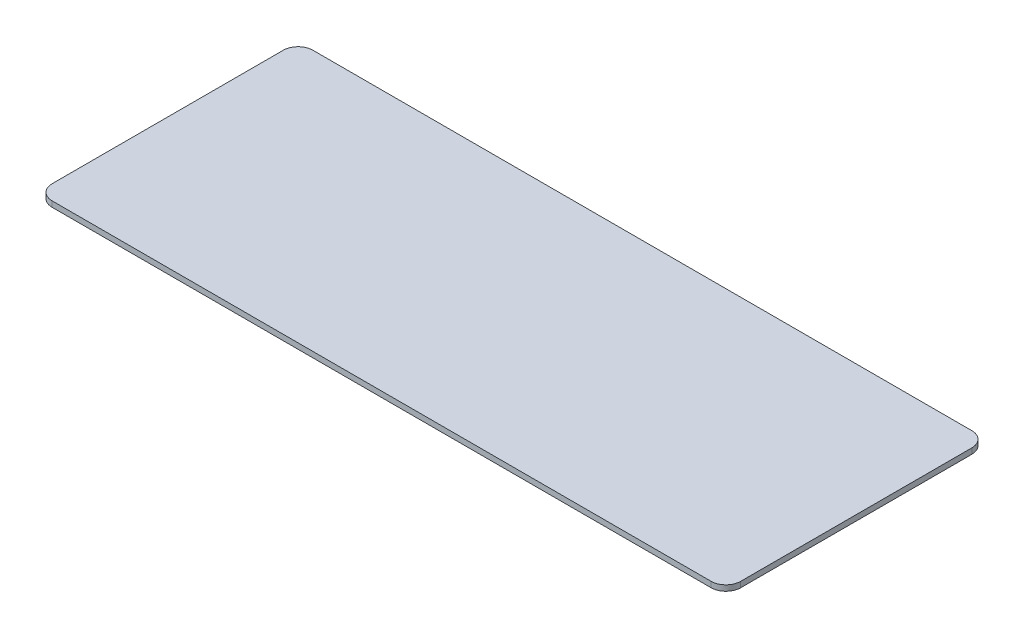
ISO-10303-21;
HEADER;
FILE_DESCRIPTION(('STEP AP214'),'2;1');
FILE_NAME('part.step','',(''),(''),'','','');
FILE_SCHEMA(('AUTOMOTIVE_DESIGN { 1 0 10303 214 1 1 1 1 }'));
ENDSEC;
DATA;
#1=APPLICATION_CONTEXT('core data for automotive mechanical design processes');
#2=APPLICATION_PROTOCOL_DEFINITION('international standard','automotive_design',2000,#1);
#3=PRODUCT_CONTEXT('',#1,'mechanical');
#4=PRODUCT('Part','Part','',(#3));
#5=PRODUCT_RELATED_PRODUCT_CATEGORY('part','',(#4));
#6=PRODUCT_DEFINITION_FORMATION('','',#4);
#7=PRODUCT_DEFINITION_CONTEXT('part definition',#1,'design');
#8=PRODUCT_DEFINITION('design','',#6,#7);
#9=PRODUCT_DEFINITION_SHAPE('','',#8);
#10=(LENGTH_UNIT() NAMED_UNIT(*) SI_UNIT(.MILLI.,.METRE.));
#11=(NAMED_UNIT(*) PLANE_ANGLE_UNIT() SI_UNIT($,.RADIAN.));
#12=(NAMED_UNIT(*) SI_UNIT($,.STERADIAN.) SOLID_ANGLE_UNIT());
#13=UNCERTAINTY_MEASURE_WITH_UNIT(LENGTH_MEASURE(1.E-05),#10,'distance_accuracy_value','');
#14=(GEOMETRIC_REPRESENTATION_CONTEXT(3) GLOBAL_UNCERTAINTY_ASSIGNED_CONTEXT((#13)) GLOBAL_UNIT_ASSIGNED_CONTEXT((#10,
#11,#12)) REPRESENTATION_CONTEXT('',''));
#15=CARTESIAN_POINT('',(0.,0.,0.));
#16=DIRECTION('',(0.,0.,1.));
#17=DIRECTION('',(1.,0.,0.));
#18=AXIS2_PLACEMENT_3D('',#15,#16,#17);
#19=CARTESIAN_POINT('',(184.1355,1.5,69.7451));
#20=DIRECTION('',(-1.,0.,0.));
#21=DIRECTION('',(0.,0.,1.));
#22=AXIS2_PLACEMENT_3D('',#19,#20,#21);
#23=PLANE('',#22);
#24=DIRECTION('',(0.,0.,-1.));
#25=VECTOR('',#24,1.);
#26=CARTESIAN_POINT('',(184.1355,1.5,69.7451));
#27=LINE('',#26,#25);
#28=CARTESIAN_POINT('',(184.1355,1.5,61.8076));
#29=VERTEX_POINT('',#28);
#30=CARTESIAN_POINT('',(184.1355,1.5,-61.8076));
#31=VERTEX_POINT('',#30);
#32=EDGE_CURVE('E120',#29,#31,#27,.T.);
#33=ORIENTED_EDGE('',*,*,#32,.F.);
#34=DIRECTION('',(0.,-1.,0.));
#35=VECTOR('',#34,1.);
#36=CARTESIAN_POINT('',(184.1355,1.5,61.8076));
#37=LINE('',#36,#35);
#38=CARTESIAN_POINT('',(184.1355,-1.5,61.8076));
#39=VERTEX_POINT('',#38);
#40=EDGE_CURVE('E105',#29,#39,#37,.T.);
#41=ORIENTED_EDGE('',*,*,#40,.T.);
#42=DIRECTION('',(0.,0.,-1.));
#43=VECTOR('',#42,1.);
#44=CARTESIAN_POINT('',(184.1355,-1.5,69.7451));
#45=LINE('',#44,#43);
#46=CARTESIAN_POINT('',(184.1355,-1.5,-61.8076));
#47=VERTEX_POINT('',#46);
#48=EDGE_CURVE('E117',#39,#47,#45,.T.);
#49=ORIENTED_EDGE('',*,*,#48,.T.);
#50=DIRECTION('',(0.,-1.,0.));
#51=VECTOR('',#50,1.);
#52=CARTESIAN_POINT('',(184.1355,1.5,-61.8076));
#53=LINE('',#52,#51);
#54=EDGE_CURVE('E122',#47,#31,#53,.F.);
#55=ORIENTED_EDGE('',*,*,#54,.T.);
#56=EDGE_LOOP('',(#33,#41,#49,#55));
#57=FACE_BOUND('',#56,.T.);
#58=ADVANCED_FACE('F35',(#57),#23,.F.);
#59=CARTESIAN_POINT('',(-184.1355,1.5,-69.7451));
#60=DIRECTION('',(0.,0.,1.));
#61=DIRECTION('',(1.,0.,0.));
#62=AXIS2_PLACEMENT_3D('',#59,#60,#61);
#63=PLANE('',#62);
#64=DIRECTION('',(-1.,0.,0.));
#65=VECTOR('',#64,1.);
#66=CARTESIAN_POINT('',(-184.1355,-1.5,-69.7451));
#67=LINE('',#66,#65);
#68=CARTESIAN_POINT('',(176.198,-1.5,-69.7451));
#69=VERTEX_POINT('',#68);
#70=CARTESIAN_POINT('',(-176.198,-1.5,-69.7451));
#71=VERTEX_POINT('',#70);
#72=EDGE_CURVE('E127',#69,#71,#67,.T.);
#73=ORIENTED_EDGE('',*,*,#72,.T.);
#74=DIRECTION('',(0.,-1.,0.));
#75=VECTOR('',#74,1.);
#76=CARTESIAN_POINT('',(-176.198,1.5,-69.7451));
#77=LINE('',#76,#75);
#78=CARTESIAN_POINT('',(-176.198,1.5,-69.7451));
#79=VERTEX_POINT('',#78);
#80=EDGE_CURVE('E11',#71,#79,#77,.F.);
#81=ORIENTED_EDGE('',*,*,#80,.T.);
#82=DIRECTION('',(-1.,0.,0.));
#83=VECTOR('',#82,1.);
#84=CARTESIAN_POINT('',(-184.1355,1.5,-69.7451));
#85=LINE('',#84,#83);
#86=CARTESIAN_POINT('',(176.198,1.5,-69.7451));
#87=VERTEX_POINT('',#86);
#88=EDGE_CURVE('E162',#87,#79,#85,.T.);
#89=ORIENTED_EDGE('',*,*,#88,.F.);
#90=DIRECTION('',(0.,-1.,0.));
#91=VECTOR('',#90,1.);
#92=CARTESIAN_POINT('',(176.198,1.5,-69.7451));
#93=LINE('',#92,#91);
#94=EDGE_CURVE('E43',#87,#69,#93,.T.);
#95=ORIENTED_EDGE('',*,*,#94,.T.);
#96=EDGE_LOOP('',(#73,#81,#89,#95));
#97=FACE_BOUND('',#96,.T.);
#98=ADVANCED_FACE('F160',(#97),#63,.F.);
#99=CARTESIAN_POINT('',(-184.1355,1.5,69.7451));
#100=DIRECTION('',(1.,0.,0.));
#101=DIRECTION('',(0.,0.,-1.));
#102=AXIS2_PLACEMENT_3D('',#99,#100,#101);
#103=PLANE('',#102);
#104=DIRECTION('',(0.,0.,1.));
#105=VECTOR('',#104,1.);
#106=CARTESIAN_POINT('',(-184.1355,1.5,69.7451));
#107=LINE('',#106,#105);
#108=CARTESIAN_POINT('',(-184.1355,1.5,-61.8076));
#109=VERTEX_POINT('',#108);
#110=CARTESIAN_POINT('',(-184.1355,1.5,61.8076));
#111=VERTEX_POINT('',#110);
#112=EDGE_CURVE('E170',#109,#111,#107,.T.);
#113=ORIENTED_EDGE('',*,*,#112,.F.);
#114=DIRECTION('',(0.,-1.,0.));
#115=VECTOR('',#114,1.);
#116=CARTESIAN_POINT('',(-184.1355,1.5,-61.8076));
#117=LINE('',#116,#115);
#118=CARTESIAN_POINT('',(-184.1355,-1.5,-61.8076));
#119=VERTEX_POINT('',#118);
#120=EDGE_CURVE('E154',#109,#119,#117,.T.);
#121=ORIENTED_EDGE('',*,*,#120,.T.);
#122=DIRECTION('',(0.,0.,1.));
#123=VECTOR('',#122,1.);
#124=CARTESIAN_POINT('',(-184.1355,-1.5,69.7451));
#125=LINE('',#124,#123);
#126=CARTESIAN_POINT('',(-184.1355,-1.5,61.8076));
#127=VERTEX_POINT('',#126);
#128=EDGE_CURVE('E130',#119,#127,#125,.T.);
#129=ORIENTED_EDGE('',*,*,#128,.T.);
#130=DIRECTION('',(0.,-1.,0.));
#131=VECTOR('',#130,1.);
#132=CARTESIAN_POINT('',(-184.1355,1.5,61.8076));
#133=LINE('',#132,#131);
#134=EDGE_CURVE('E50',#127,#111,#133,.F.);
#135=ORIENTED_EDGE('',*,*,#134,.T.);
#136=EDGE_LOOP('',(#113,#121,#129,#135));
#137=FACE_BOUND('',#136,.T.);
#138=ADVANCED_FACE('F169',(#137),#103,.F.);
#139=CARTESIAN_POINT('',(-184.1355,1.5,69.7451));
#140=DIRECTION('',(0.,0.,-1.));
#141=DIRECTION('',(-1.,0.,0.));
#142=AXIS2_PLACEMENT_3D('',#139,#140,#141);
#143=PLANE('',#142);
#144=DIRECTION('',(1.,0.,0.));
#145=VECTOR('',#144,1.);
#146=CARTESIAN_POINT('',(-184.1355,-1.5,69.7451));
#147=LINE('',#146,#145);
#148=CARTESIAN_POINT('',(-176.198,-1.5,69.7451));
#149=VERTEX_POINT('',#148);
#150=CARTESIAN_POINT('',(176.198,-1.5,69.7451));
#151=VERTEX_POINT('',#150);
#152=EDGE_CURVE('E137',#149,#151,#147,.T.);
#153=ORIENTED_EDGE('',*,*,#152,.T.);
#154=DIRECTION('',(0.,-1.,0.));
#155=VECTOR('',#154,1.);
#156=CARTESIAN_POINT('',(176.198,1.5,69.7451));
#157=LINE('',#156,#155);
#158=CARTESIAN_POINT('',(176.198,1.5,69.7451));
#159=VERTEX_POINT('',#158);
#160=EDGE_CURVE('E106',#151,#159,#157,.F.);
#161=ORIENTED_EDGE('',*,*,#160,.T.);
#162=DIRECTION('',(1.,0.,0.));
#163=VECTOR('',#162,1.);
#164=CARTESIAN_POINT('',(-184.1355,1.5,69.7451));
#165=LINE('',#164,#163);
#166=CARTESIAN_POINT('',(-176.198,1.5,69.7451));
#167=VERTEX_POINT('',#166);
#168=EDGE_CURVE('E133',#167,#159,#165,.T.);
#169=ORIENTED_EDGE('',*,*,#168,.F.);
#170=DIRECTION('',(0.,-1.,0.));
#171=VECTOR('',#170,1.);
#172=CARTESIAN_POINT('',(-176.198,1.5,69.7451));
#173=LINE('',#172,#171);
#174=EDGE_CURVE('E111',#167,#149,#173,.T.);
#175=ORIENTED_EDGE('',*,*,#174,.T.);
#176=EDGE_LOOP('',(#153,#161,#169,#175));
#177=FACE_BOUND('',#176,.T.);
#178=ADVANCED_FACE('F200',(#177),#143,.F.);
#179=CARTESIAN_POINT('',(0.,1.5,0.));
#180=DIRECTION('',(0.,-1.,0.));
#181=DIRECTION('',(0.,0.,-1.));
#182=AXIS2_PLACEMENT_3D('',#179,#180,#181);
#183=PLANE('',#182);
#184=ORIENTED_EDGE('',*,*,#168,.T.);
#185=CARTESIAN_POINT('',(176.198,1.5,61.8076));
#186=DIRECTION('',(0.,-1.,0.));
#187=DIRECTION('',(0.,0.,-1.));
#188=AXIS2_PLACEMENT_3D('',#185,#186,#187);
#189=CIRCLE('',#188,7.9375);
#190=EDGE_CURVE('E151',#159,#29,#189,.F.);
#191=ORIENTED_EDGE('',*,*,#190,.T.);
#192=ORIENTED_EDGE('',*,*,#32,.T.);
#193=CARTESIAN_POINT('',(176.198,1.5,-61.8076));
#194=DIRECTION('',(0.,-1.,0.));
#195=DIRECTION('',(0.,0.,-1.));
#196=AXIS2_PLACEMENT_3D('',#193,#194,#195);
#197=CIRCLE('',#196,7.9375);
#198=EDGE_CURVE('E148',#31,#87,#197,.F.);
#199=ORIENTED_EDGE('',*,*,#198,.T.);
#200=ORIENTED_EDGE('',*,*,#88,.T.);
#201=CARTESIAN_POINT('',(-176.198,1.5,-61.8076));
#202=DIRECTION('',(0.,-1.,0.));
#203=DIRECTION('',(0.,0.,-1.));
#204=AXIS2_PLACEMENT_3D('',#201,#202,#203);
#205=CIRCLE('',#204,7.9375);
#206=EDGE_CURVE('E57',#79,#109,#205,.F.);
#207=ORIENTED_EDGE('',*,*,#206,.T.);
#208=ORIENTED_EDGE('',*,*,#112,.T.);
#209=CARTESIAN_POINT('',(-176.198,1.5,61.8076));
#210=DIRECTION('',(0.,-1.,0.));
#211=DIRECTION('',(0.,0.,-1.));
#212=AXIS2_PLACEMENT_3D('',#209,#210,#211);
#213=CIRCLE('',#212,7.9375);
#214=EDGE_CURVE('E146',#111,#167,#213,.F.);
#215=ORIENTED_EDGE('',*,*,#214,.T.);
#216=EDGE_LOOP('',(#184,#191,#192,#199,#200,#207,#208,#215));
#217=FACE_BOUND('',#216,.T.);
#218=ADVANCED_FACE('F175',(#217),#183,.F.);
#219=CARTESIAN_POINT('',(0.,-1.5,0.));
#220=DIRECTION('',(0.,-1.,0.));
#221=DIRECTION('',(0.,0.,-1.));
#222=AXIS2_PLACEMENT_3D('',#219,#220,#221);
#223=PLANE('',#222);
#224=ORIENTED_EDGE('',*,*,#48,.F.);
#225=CARTESIAN_POINT('',(176.198,-1.5,61.8076));
#226=DIRECTION('',(0.,-1.,0.));
#227=DIRECTION('',(0.,0.,-1.));
#228=AXIS2_PLACEMENT_3D('',#225,#226,#227);
#229=CIRCLE('',#228,7.9375);
#230=EDGE_CURVE('E101',#39,#151,#229,.T.);
#231=ORIENTED_EDGE('',*,*,#230,.T.);
#232=ORIENTED_EDGE('',*,*,#152,.F.);
#233=CARTESIAN_POINT('',(-176.198,-1.5,61.8076));
#234=DIRECTION('',(0.,-1.,0.));
#235=DIRECTION('',(0.,0.,-1.));
#236=AXIS2_PLACEMENT_3D('',#233,#234,#235);
#237=CIRCLE('',#236,7.9375);
#238=EDGE_CURVE('E121',#149,#127,#237,.T.);
#239=ORIENTED_EDGE('',*,*,#238,.T.);
#240=ORIENTED_EDGE('',*,*,#128,.F.);
#241=CARTESIAN_POINT('',(-176.198,-1.5,-61.8076));
#242=DIRECTION('',(0.,-1.,0.));
#243=DIRECTION('',(0.,0.,-1.));
#244=AXIS2_PLACEMENT_3D('',#241,#242,#243);
#245=CIRCLE('',#244,7.9375);
#246=EDGE_CURVE('E112',#119,#71,#245,.T.);
#247=ORIENTED_EDGE('',*,*,#246,.T.);
#248=ORIENTED_EDGE('',*,*,#72,.F.);
#249=CARTESIAN_POINT('',(176.198,-1.5,-61.8076));
#250=DIRECTION('',(0.,-1.,0.));
#251=DIRECTION('',(0.,0.,-1.));
#252=AXIS2_PLACEMENT_3D('',#249,#250,#251);
#253=CIRCLE('',#252,7.9375);
#254=EDGE_CURVE('E126',#69,#47,#253,.T.);
#255=ORIENTED_EDGE('',*,*,#254,.T.);
#256=EDGE_LOOP('',(#224,#231,#232,#239,#240,#247,#248,#255));
#257=FACE_BOUND('',#256,.T.);
#258=ADVANCED_FACE('F124',(#257),#223,.T.);
#259=CARTESIAN_POINT('',(176.198,1.5,61.8076));
#260=DIRECTION('',(0.,-1.,0.));
#261=DIRECTION('',(0.,0.,-1.));
#262=AXIS2_PLACEMENT_3D('',#259,#260,#261);
#263=CYLINDRICAL_SURFACE('',#262,7.9375);
#264=ORIENTED_EDGE('',*,*,#190,.F.);
#265=ORIENTED_EDGE('',*,*,#160,.F.);
#266=ORIENTED_EDGE('',*,*,#230,.F.);
#267=ORIENTED_EDGE('',*,*,#40,.F.);
#268=EDGE_LOOP('',(#264,#265,#266,#267));
#269=FACE_BOUND('',#268,.T.);
#270=ADVANCED_FACE('F104',(#269),#263,.T.);
#271=CARTESIAN_POINT('',(-176.198,1.5,-61.8076));
#272=DIRECTION('',(0.,-1.,0.));
#273=DIRECTION('',(0.,0.,-1.));
#274=AXIS2_PLACEMENT_3D('',#271,#272,#273);
#275=CYLINDRICAL_SURFACE('',#274,7.9375);
#276=ORIENTED_EDGE('',*,*,#206,.F.);
#277=ORIENTED_EDGE('',*,*,#80,.F.);
#278=ORIENTED_EDGE('',*,*,#246,.F.);
#279=ORIENTED_EDGE('',*,*,#120,.F.);
#280=EDGE_LOOP('',(#276,#277,#278,#279));
#281=FACE_BOUND('',#280,.T.);
#282=ADVANCED_FACE('F168',(#281),#275,.T.);
#283=CARTESIAN_POINT('',(176.198,1.5,-61.8076));
#284=DIRECTION('',(0.,-1.,0.));
#285=DIRECTION('',(0.,0.,-1.));
#286=AXIS2_PLACEMENT_3D('',#283,#284,#285);
#287=CYLINDRICAL_SURFACE('',#286,7.9375);
#288=ORIENTED_EDGE('',*,*,#198,.F.);
#289=ORIENTED_EDGE('',*,*,#54,.F.);
#290=ORIENTED_EDGE('',*,*,#254,.F.);
#291=ORIENTED_EDGE('',*,*,#94,.F.);
#292=EDGE_LOOP('',(#288,#289,#290,#291));
#293=FACE_BOUND('',#292,.T.);
#294=ADVANCED_FACE('F176',(#293),#287,.T.);
#295=CARTESIAN_POINT('',(-176.198,1.5,61.8076));
#296=DIRECTION('',(0.,-1.,0.));
#297=DIRECTION('',(0.,0.,-1.));
#298=AXIS2_PLACEMENT_3D('',#295,#296,#297);
#299=CYLINDRICAL_SURFACE('',#298,7.9375);
#300=ORIENTED_EDGE('',*,*,#214,.F.);
#301=ORIENTED_EDGE('',*,*,#134,.F.);
#302=ORIENTED_EDGE('',*,*,#238,.F.);
#303=ORIENTED_EDGE('',*,*,#174,.F.);
#304=EDGE_LOOP('',(#300,#301,#302,#303));
#305=FACE_BOUND('',#304,.T.);
#306=ADVANCED_FACE('F37',(#305),#299,.T.);
#307=CLOSED_SHELL('',(#58,#98,#138,#178,#218,#258,#270,#282,#294,#306));
#308=MANIFOLD_SOLID_BREP('B2',#307);
#309=ADVANCED_BREP_SHAPE_REPRESENTATION('',(#18,#308),#14);
#310=SHAPE_DEFINITION_REPRESENTATION(#9,#309);
ENDSEC;
END-ISO-10303-21;
